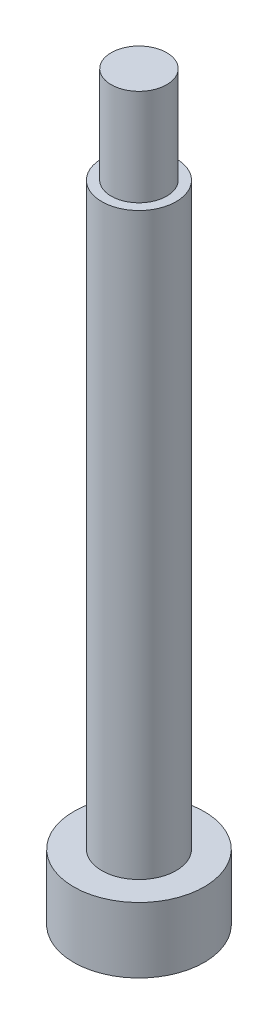
ISO-10303-21;
HEADER;
FILE_DESCRIPTION(('STEP AP214'),'2;1');
FILE_NAME('part.step','',(''),(''),'','','');
FILE_SCHEMA(('AUTOMOTIVE_DESIGN { 1 0 10303 214 1 1 1 1 }'));
ENDSEC;
DATA;
#1=APPLICATION_CONTEXT('core data for automotive mechanical design processes');
#2=APPLICATION_PROTOCOL_DEFINITION('international standard','automotive_design',2000,#1);
#3=PRODUCT_CONTEXT('',#1,'mechanical');
#4=PRODUCT('Part','Part','',(#3));
#5=PRODUCT_RELATED_PRODUCT_CATEGORY('part','',(#4));
#6=PRODUCT_DEFINITION_FORMATION('','',#4);
#7=PRODUCT_DEFINITION_CONTEXT('part definition',#1,'design');
#8=PRODUCT_DEFINITION('design','',#6,#7);
#9=PRODUCT_DEFINITION_SHAPE('','',#8);
#10=(LENGTH_UNIT() NAMED_UNIT(*) SI_UNIT(.MILLI.,.METRE.));
#11=(NAMED_UNIT(*) PLANE_ANGLE_UNIT() SI_UNIT($,.RADIAN.));
#12=(NAMED_UNIT(*) SI_UNIT($,.STERADIAN.) SOLID_ANGLE_UNIT());
#13=UNCERTAINTY_MEASURE_WITH_UNIT(LENGTH_MEASURE(1.E-05),#10,'distance_accuracy_value','');
#14=(GEOMETRIC_REPRESENTATION_CONTEXT(3) GLOBAL_UNCERTAINTY_ASSIGNED_CONTEXT((#13)) GLOBAL_UNIT_ASSIGNED_CONTEXT((#10,
#11,#12)) REPRESENTATION_CONTEXT('',''));
#15=CARTESIAN_POINT('',(0.,0.,0.));
#16=DIRECTION('',(0.,0.,1.));
#17=DIRECTION('',(1.,0.,0.));
#18=AXIS2_PLACEMENT_3D('',#15,#16,#17);
#19=CARTESIAN_POINT('',(0.,3.4417,0.));
#20=DIRECTION('',(0.,-1.,0.));
#21=DIRECTION('',(0.,0.,-1.));
#22=AXIS2_PLACEMENT_3D('',#19,#20,#21);
#23=CYLINDRICAL_SURFACE('',#22,3.43535);
#24=CARTESIAN_POINT('',(0.,3.4417,0.));
#25=DIRECTION('',(0.,1.,0.));
#26=DIRECTION('',(0.,0.,1.));
#27=AXIS2_PLACEMENT_3D('',#24,#25,#26);
#28=CIRCLE('',#27,3.43535);
#29=CARTESIAN_POINT('',(0.,3.4417,3.43535));
#30=VERTEX_POINT('',#29);
#31=EDGE_CURVE('E60',#30,#30,#28,.T.);
#32=ORIENTED_EDGE('',*,*,#31,.F.);
#33=EDGE_LOOP('',(#32));
#34=FACE_BOUND('',#33,.T.);
#35=CARTESIAN_POINT('',(0.,0.,0.));
#36=DIRECTION('',(0.,1.,0.));
#37=DIRECTION('',(0.,0.,1.));
#38=AXIS2_PLACEMENT_3D('',#35,#36,#37);
#39=CIRCLE('',#38,3.43535);
#40=CARTESIAN_POINT('',(0.,0.,3.43535));
#41=VERTEX_POINT('',#40);
#42=EDGE_CURVE('E46',#41,#41,#39,.T.);
#43=ORIENTED_EDGE('',*,*,#42,.T.);
#44=EDGE_LOOP('',(#43));
#45=FACE_BOUND('',#44,.T.);
#46=ADVANCED_FACE('F43',(#34,#45),#23,.T.);
#47=CARTESIAN_POINT('',(0.,3.4417,0.));
#48=DIRECTION('',(0.,1.,0.));
#49=DIRECTION('',(0.,0.,1.));
#50=AXIS2_PLACEMENT_3D('',#47,#48,#49);
#51=PLANE('',#50);
#52=CARTESIAN_POINT('',(0.,3.4417,0.));
#53=DIRECTION('',(0.,1.,0.));
#54=DIRECTION('',(0.,0.,1.));
#55=AXIS2_PLACEMENT_3D('',#52,#53,#54);
#56=CIRCLE('',#55,1.9558);
#57=CARTESIAN_POINT('',(0.,3.4417,-1.9558));
#58=VERTEX_POINT('',#57);
#59=EDGE_CURVE('E51',#58,#58,#56,.T.);
#60=ORIENTED_EDGE('',*,*,#59,.F.);
#61=EDGE_LOOP('',(#60));
#62=FACE_BOUND('',#61,.T.);
#63=ORIENTED_EDGE('',*,*,#31,.T.);
#64=EDGE_LOOP('',(#63));
#65=FACE_BOUND('',#64,.T.);
#66=ADVANCED_FACE('F80',(#62,#65),#51,.T.);
#67=CARTESIAN_POINT('',(0.,0.,0.));
#68=DIRECTION('',(0.,1.,0.));
#69=DIRECTION('',(0.,0.,1.));
#70=AXIS2_PLACEMENT_3D('',#67,#68,#69);
#71=PLANE('',#70);
#72=ORIENTED_EDGE('',*,*,#42,.F.);
#73=EDGE_LOOP('',(#72));
#74=FACE_BOUND('',#73,.T.);
#75=ADVANCED_FACE('F74',(#74),#71,.F.);
#76=CARTESIAN_POINT('',(0.,33.9217,0.));
#77=DIRECTION('',(0.,-1.,0.));
#78=DIRECTION('',(0.,0.,-1.));
#79=AXIS2_PLACEMENT_3D('',#76,#77,#78);
#80=CYLINDRICAL_SURFACE('',#79,1.9558);
#81=CARTESIAN_POINT('',(0.,33.9217,0.));
#82=DIRECTION('',(0.,1.,0.));
#83=DIRECTION('',(0.,0.,1.));
#84=AXIS2_PLACEMENT_3D('',#81,#82,#83);
#85=CIRCLE('',#84,1.9558);
#86=CARTESIAN_POINT('',(0.,33.9217,-1.9558));
#87=VERTEX_POINT('',#86);
#88=EDGE_CURVE('E65',#87,#87,#85,.T.);
#89=CARTESIAN_POINT('',(0.,33.9217,-1.9558));
#90=CARTESIAN_POINT('',(0.,33.6042,-1.9558));
#91=CARTESIAN_POINT('',(0.,33.2867,-1.9558));
#92=CARTESIAN_POINT('',(0.,32.6517,-1.9558));
#93=CARTESIAN_POINT('',(0.,32.3342,-1.9558));
#94=CARTESIAN_POINT('',(0.,31.6992,-1.9558));
#95=CARTESIAN_POINT('',(0.,31.3817,-1.9558));
#96=CARTESIAN_POINT('',(0.,30.7467,-1.9558));
#97=CARTESIAN_POINT('',(0.,30.4292,-1.9558));
#98=CARTESIAN_POINT('',(0.,29.7942,-1.9558));
#99=CARTESIAN_POINT('',(0.,29.4767,-1.9558));
#100=CARTESIAN_POINT('',(0.,28.8417,-1.9558));
#101=CARTESIAN_POINT('',(0.,28.5242,-1.9558));
#102=CARTESIAN_POINT('',(0.,27.8892,-1.9558));
#103=CARTESIAN_POINT('',(0.,27.5717,-1.9558));
#104=CARTESIAN_POINT('',(0.,26.9367,-1.9558));
#105=CARTESIAN_POINT('',(0.,26.6192,-1.9558));
#106=CARTESIAN_POINT('',(0.,25.9842,-1.9558));
#107=CARTESIAN_POINT('',(0.,25.6667,-1.9558));
#108=CARTESIAN_POINT('',(0.,25.0317,-1.9558));
#109=CARTESIAN_POINT('',(0.,24.7142,-1.9558));
#110=CARTESIAN_POINT('',(0.,24.0792,-1.9558));
#111=CARTESIAN_POINT('',(0.,23.7617,-1.9558));
#112=CARTESIAN_POINT('',(0.,23.1267,-1.9558));
#113=CARTESIAN_POINT('',(0.,22.8092,-1.9558));
#114=CARTESIAN_POINT('',(0.,22.1742,-1.9558));
#115=CARTESIAN_POINT('',(0.,21.8567,-1.9558));
#116=CARTESIAN_POINT('',(0.,21.2217,-1.9558));
#117=CARTESIAN_POINT('',(0.,20.9042,-1.9558));
#118=CARTESIAN_POINT('',(0.,20.2692,-1.9558));
#119=CARTESIAN_POINT('',(0.,19.9517,-1.9558));
#120=CARTESIAN_POINT('',(0.,19.3167,-1.9558));
#121=CARTESIAN_POINT('',(0.,18.9992,-1.9558));
#122=CARTESIAN_POINT('',(0.,18.3642,-1.9558));
#123=CARTESIAN_POINT('',(0.,18.0467,-1.9558));
#124=CARTESIAN_POINT('',(0.,17.4117,-1.9558));
#125=CARTESIAN_POINT('',(0.,17.0942,-1.9558));
#126=CARTESIAN_POINT('',(0.,16.4592,-1.9558));
#127=CARTESIAN_POINT('',(0.,16.1417,-1.9558));
#128=CARTESIAN_POINT('',(0.,15.5067,-1.9558));
#129=CARTESIAN_POINT('',(0.,15.1892,-1.9558));
#130=CARTESIAN_POINT('',(0.,14.5542,-1.9558));
#131=CARTESIAN_POINT('',(0.,14.2367,-1.9558));
#132=CARTESIAN_POINT('',(0.,13.6017,-1.9558));
#133=CARTESIAN_POINT('',(0.,13.2842,-1.9558));
#134=CARTESIAN_POINT('',(0.,12.6492,-1.9558));
#135=CARTESIAN_POINT('',(0.,12.3317,-1.9558));
#136=CARTESIAN_POINT('',(0.,11.6967,-1.9558));
#137=CARTESIAN_POINT('',(0.,11.3792,-1.9558));
#138=CARTESIAN_POINT('',(0.,10.7442,-1.9558));
#139=CARTESIAN_POINT('',(0.,10.4267,-1.9558));
#140=CARTESIAN_POINT('',(0.,9.7917,-1.9558));
#141=CARTESIAN_POINT('',(0.,9.4742,-1.9558));
#142=CARTESIAN_POINT('',(0.,8.8392,-1.9558));
#143=CARTESIAN_POINT('',(0.,8.5217,-1.9558));
#144=CARTESIAN_POINT('',(0.,7.8867,-1.9558));
#145=CARTESIAN_POINT('',(0.,7.5692,-1.9558));
#146=CARTESIAN_POINT('',(0.,6.9342,-1.9558));
#147=CARTESIAN_POINT('',(0.,6.6167,-1.9558));
#148=CARTESIAN_POINT('',(0.,5.9817,-1.9558));
#149=CARTESIAN_POINT('',(0.,5.6642,-1.9558));
#150=CARTESIAN_POINT('',(0.,5.0292,-1.9558));
#151=CARTESIAN_POINT('',(0.,4.7117,-1.9558));
#152=CARTESIAN_POINT('',(0.,4.0767,-1.9558));
#153=CARTESIAN_POINT('',(0.,3.7592,-1.9558));
#154=CARTESIAN_POINT('',(0.,3.4417,-1.9558));
#155=B_SPLINE_CURVE_WITH_KNOTS('',3,(#89,#90,#91,#92,#93,#94,#95,#96,#97,#98,#99,#100,#101,#102,
#103,#104,#105,#106,#107,#108,#109,#110,#111,#112,#113,#114,#115,#116,#117,#118,#119,#120,#121,
#122,#123,#124,#125,#126,#127,#128,#129,#130,#131,#132,#133,#134,#135,#136,#137,#138,#139,#140,
#141,#142,#143,#144,#145,#146,#147,#148,#149,#150,#151,#152,#153,#154),.UNSPECIFIED.,.F.,.F.,(4,
2,2,2,2,2,2,2,2,2,2,2,2,2,2,2,2,2,2,2,2,2,2,2,2,2,2,2,2,2,2,2,4),(0.,0.952499999999995,1.905,
2.8575,3.80999999999999,4.7625,5.71499999999999,6.66749999999999,7.61999999999999,
8.57249999999999,9.52499999999999,10.4775,11.43,12.3825,13.335,14.2875,15.24,16.1925,17.145,
18.0975,19.05,20.0025,20.955,21.9075,22.86,23.8125,24.765,25.7175,26.67,27.6225,28.575,29.5275,
30.48),.UNSPECIFIED.);
#156=EDGE_CURVE('BSEAM77',#87,#58,#155,.T.);
#157=ORIENTED_EDGE('',*,*,#88,.F.);
#158=ORIENTED_EDGE('',*,*,#59,.T.);
#159=ORIENTED_EDGE('',*,*,#156,.T.);
#160=ORIENTED_EDGE('',*,*,#156,.F.);
#161=EDGE_LOOP('',(#157,#159,#158,#160));
#162=FACE_BOUND('',#161,.T.);
#163=ADVANCED_FACE('F77',(#162),#80,.T.);
#164=CARTESIAN_POINT('',(0.,33.9217,0.));
#165=DIRECTION('',(0.,1.,0.));
#166=DIRECTION('',(0.,0.,1.));
#167=AXIS2_PLACEMENT_3D('',#164,#165,#166);
#168=PLANE('',#167);
#169=CARTESIAN_POINT('',(0.,33.9217,0.));
#170=DIRECTION('',(0.,1.,0.));
#171=DIRECTION('',(0.,0.,1.));
#172=AXIS2_PLACEMENT_3D('',#169,#170,#171);
#173=CIRCLE('',#172,1.4605);
#174=CARTESIAN_POINT('',(0.,33.9217,1.4605));
#175=VERTEX_POINT('',#174);
#176=EDGE_CURVE('E10',#175,#175,#173,.T.);
#177=ORIENTED_EDGE('',*,*,#176,.F.);
#178=EDGE_LOOP('',(#177));
#179=FACE_BOUND('',#178,.T.);
#180=ORIENTED_EDGE('',*,*,#88,.T.);
#181=EDGE_LOOP('',(#180));
#182=FACE_BOUND('',#181,.T.);
#183=ADVANCED_FACE('F84',(#179,#182),#168,.T.);
#184=CARTESIAN_POINT('',(0.,39.0017,0.));
#185=DIRECTION('',(0.,-1.,0.));
#186=DIRECTION('',(0.,0.,-1.));
#187=AXIS2_PLACEMENT_3D('',#184,#185,#186);
#188=CYLINDRICAL_SURFACE('',#187,1.4605);
#189=CARTESIAN_POINT('',(0.,39.0017,0.));
#190=DIRECTION('',(0.,1.,0.));
#191=DIRECTION('',(0.,0.,1.));
#192=AXIS2_PLACEMENT_3D('',#189,#190,#191);
#193=CIRCLE('',#192,1.4605);
#194=CARTESIAN_POINT('',(0.,39.0017,1.4605));
#195=VERTEX_POINT('',#194);
#196=EDGE_CURVE('E62',#195,#195,#193,.T.);
#197=ORIENTED_EDGE('',*,*,#196,.F.);
#198=EDGE_LOOP('',(#197));
#199=FACE_BOUND('',#198,.T.);
#200=ORIENTED_EDGE('',*,*,#176,.T.);
#201=EDGE_LOOP('',(#200));
#202=FACE_BOUND('',#201,.T.);
#203=ADVANCED_FACE('F120',(#199,#202),#188,.T.);
#204=CARTESIAN_POINT('',(0.,39.0017,0.));
#205=DIRECTION('',(0.,1.,0.));
#206=DIRECTION('',(0.,0.,1.));
#207=AXIS2_PLACEMENT_3D('',#204,#205,#206);
#208=PLANE('',#207);
#209=ORIENTED_EDGE('',*,*,#196,.T.);
#210=EDGE_LOOP('',(#209));
#211=FACE_BOUND('',#210,.T.);
#212=ADVANCED_FACE('F130',(#211),#208,.T.);
#213=CLOSED_SHELL('',(#46,#66,#75,#163,#183,#203,#212));
#214=MANIFOLD_SOLID_BREP('B2',#213);
#215=ADVANCED_BREP_SHAPE_REPRESENTATION('',(#18,#214),#14);
#216=SHAPE_DEFINITION_REPRESENTATION(#9,#215);
ENDSEC;
END-ISO-10303-21;
